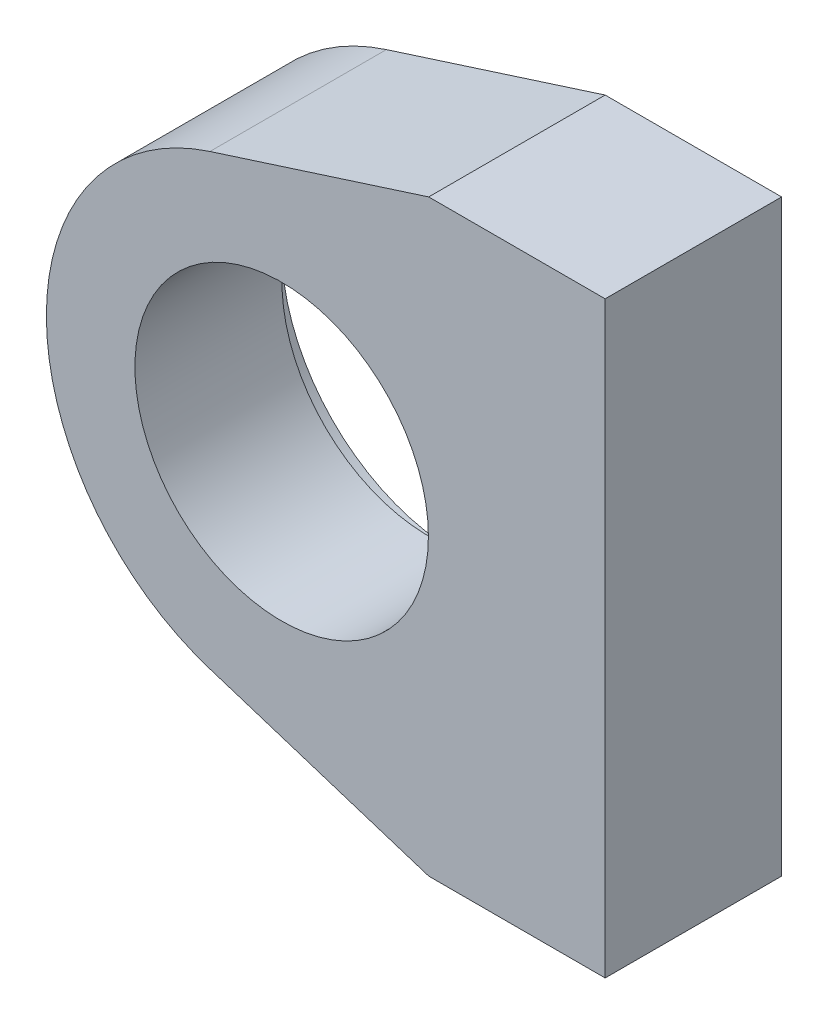
ISO-10303-21;
HEADER;
FILE_DESCRIPTION(('STEP AP214'),'2;1');
FILE_NAME('part.step','',(''),(''),'','','');
FILE_SCHEMA(('AUTOMOTIVE_DESIGN { 1 0 10303 214 1 1 1 1 }'));
ENDSEC;
DATA;
#1=APPLICATION_CONTEXT('core data for automotive mechanical design processes');
#2=APPLICATION_PROTOCOL_DEFINITION('international standard','automotive_design',2000,#1);
#3=PRODUCT_CONTEXT('',#1,'mechanical');
#4=PRODUCT('Part','Part','',(#3));
#5=PRODUCT_RELATED_PRODUCT_CATEGORY('part','',(#4));
#6=PRODUCT_DEFINITION_FORMATION('','',#4);
#7=PRODUCT_DEFINITION_CONTEXT('part definition',#1,'design');
#8=PRODUCT_DEFINITION('design','',#6,#7);
#9=PRODUCT_DEFINITION_SHAPE('','',#8);
#10=(LENGTH_UNIT() NAMED_UNIT(*) SI_UNIT(.MILLI.,.METRE.));
#11=(NAMED_UNIT(*) PLANE_ANGLE_UNIT() SI_UNIT($,.RADIAN.));
#12=(NAMED_UNIT(*) SI_UNIT($,.STERADIAN.) SOLID_ANGLE_UNIT());
#13=UNCERTAINTY_MEASURE_WITH_UNIT(LENGTH_MEASURE(1.E-05),#10,'distance_accuracy_value','');
#14=(GEOMETRIC_REPRESENTATION_CONTEXT(3) GLOBAL_UNCERTAINTY_ASSIGNED_CONTEXT((#13)) GLOBAL_UNIT_ASSIGNED_CONTEXT((#10,
#11,#12)) REPRESENTATION_CONTEXT('',''));
#15=CARTESIAN_POINT('',(0.,0.,0.));
#16=DIRECTION('',(0.,0.,1.));
#17=DIRECTION('',(1.,0.,0.));
#18=AXIS2_PLACEMENT_3D('',#15,#16,#17);
#19=CARTESIAN_POINT('',(0.,0.,-0.00100000000000013));
#20=DIRECTION('',(0.,0.,1.));
#21=DIRECTION('',(1.,0.,0.));
#22=AXIS2_PLACEMENT_3D('',#19,#20,#21);
#23=CYLINDRICAL_SURFACE('',#22,4.99);
#24=CARTESIAN_POINT('',(0.,0.,6.));
#25=DIRECTION('',(0.,0.,1.));
#26=DIRECTION('',(1.,0.,0.));
#27=AXIS2_PLACEMENT_3D('',#24,#25,#26);
#28=CIRCLE('',#27,4.99);
#29=CARTESIAN_POINT('',(4.99,0.,6.));
#30=VERTEX_POINT('',#29);
#31=EDGE_CURVE('E123',#30,#30,#28,.T.);
#32=CARTESIAN_POINT('',(0.,0.,1.));
#33=DIRECTION('',(0.,0.,-1.));
#34=DIRECTION('',(-1.,0.,0.));
#35=AXIS2_PLACEMENT_3D('',#32,#33,#34);
#36=CIRCLE('',#35,4.99);
#37=CARTESIAN_POINT('',(4.99,0.,1.));
#38=VERTEX_POINT('',#37);
#39=EDGE_CURVE('E37',#38,#38,#36,.F.);
#40=CARTESIAN_POINT('',(4.99,0.,6.));
#41=CARTESIAN_POINT('',(4.99,0.,5.94791666666667));
#42=CARTESIAN_POINT('',(4.99,0.,5.89583333333333));
#43=CARTESIAN_POINT('',(4.99,0.,5.79166666666667));
#44=CARTESIAN_POINT('',(4.99,0.,5.73958333333333));
#45=CARTESIAN_POINT('',(4.99,0.,5.63541666666667));
#46=CARTESIAN_POINT('',(4.99,0.,5.58333333333333));
#47=CARTESIAN_POINT('',(4.99,0.,5.47916666666667));
#48=CARTESIAN_POINT('',(4.99,0.,5.42708333333333));
#49=CARTESIAN_POINT('',(4.99,0.,5.32291666666667));
#50=CARTESIAN_POINT('',(4.99,0.,5.27083333333333));
#51=CARTESIAN_POINT('',(4.99,0.,5.16666666666667));
#52=CARTESIAN_POINT('',(4.99,0.,5.11458333333333));
#53=CARTESIAN_POINT('',(4.99,0.,5.01041666666667));
#54=CARTESIAN_POINT('',(4.99,0.,4.95833333333333));
#55=CARTESIAN_POINT('',(4.99,0.,4.85416666666667));
#56=CARTESIAN_POINT('',(4.99,0.,4.80208333333333));
#57=CARTESIAN_POINT('',(4.99,0.,4.69791666666667));
#58=CARTESIAN_POINT('',(4.99,0.,4.64583333333333));
#59=CARTESIAN_POINT('',(4.99,0.,4.54166666666667));
#60=CARTESIAN_POINT('',(4.99,0.,4.48958333333333));
#61=CARTESIAN_POINT('',(4.99,0.,4.38541666666667));
#62=CARTESIAN_POINT('',(4.99,0.,4.33333333333333));
#63=CARTESIAN_POINT('',(4.99,0.,4.22916666666667));
#64=CARTESIAN_POINT('',(4.99,0.,4.17708333333333));
#65=CARTESIAN_POINT('',(4.99,0.,4.07291666666667));
#66=CARTESIAN_POINT('',(4.99,0.,4.02083333333333));
#67=CARTESIAN_POINT('',(4.99,0.,3.91666666666667));
#68=CARTESIAN_POINT('',(4.99,0.,3.86458333333333));
#69=CARTESIAN_POINT('',(4.99,0.,3.76041666666667));
#70=CARTESIAN_POINT('',(4.99,0.,3.70833333333333));
#71=CARTESIAN_POINT('',(4.99,0.,3.60416666666667));
#72=CARTESIAN_POINT('',(4.99,0.,3.55208333333333));
#73=CARTESIAN_POINT('',(4.99,0.,3.44791666666667));
#74=CARTESIAN_POINT('',(4.99,0.,3.39583333333333));
#75=CARTESIAN_POINT('',(4.99,0.,3.29166666666667));
#76=CARTESIAN_POINT('',(4.99,0.,3.23958333333333));
#77=CARTESIAN_POINT('',(4.99,0.,3.13541666666667));
#78=CARTESIAN_POINT('',(4.99,0.,3.08333333333333));
#79=CARTESIAN_POINT('',(4.99,0.,2.97916666666667));
#80=CARTESIAN_POINT('',(4.99,0.,2.92708333333333));
#81=CARTESIAN_POINT('',(4.99,0.,2.82291666666667));
#82=CARTESIAN_POINT('',(4.99,0.,2.77083333333333));
#83=CARTESIAN_POINT('',(4.99,0.,2.66666666666667));
#84=CARTESIAN_POINT('',(4.99,0.,2.61458333333333));
#85=CARTESIAN_POINT('',(4.99,0.,2.51041666666667));
#86=CARTESIAN_POINT('',(4.99,0.,2.45833333333333));
#87=CARTESIAN_POINT('',(4.99,0.,2.35416666666667));
#88=CARTESIAN_POINT('',(4.99,0.,2.30208333333333));
#89=CARTESIAN_POINT('',(4.99,0.,2.19791666666667));
#90=CARTESIAN_POINT('',(4.99,0.,2.14583333333333));
#91=CARTESIAN_POINT('',(4.99,0.,2.04166666666667));
#92=CARTESIAN_POINT('',(4.99,0.,1.98958333333333));
#93=CARTESIAN_POINT('',(4.99,0.,1.88541666666667));
#94=CARTESIAN_POINT('',(4.99,0.,1.83333333333333));
#95=CARTESIAN_POINT('',(4.99,0.,1.72916666666667));
#96=CARTESIAN_POINT('',(4.99,0.,1.67708333333333));
#97=CARTESIAN_POINT('',(4.99,0.,1.57291666666667));
#98=CARTESIAN_POINT('',(4.99,0.,1.52083333333333));
#99=CARTESIAN_POINT('',(4.99,0.,1.41666666666667));
#100=CARTESIAN_POINT('',(4.99,0.,1.36458333333333));
#101=CARTESIAN_POINT('',(4.99,0.,1.26041666666667));
#102=CARTESIAN_POINT('',(4.99,0.,1.20833333333333));
#103=CARTESIAN_POINT('',(4.99,0.,1.10416666666667));
#104=CARTESIAN_POINT('',(4.99,0.,1.05208333333333));
#105=CARTESIAN_POINT('',(4.99,0.,1.));
#106=B_SPLINE_CURVE_WITH_KNOTS('',3,(#40,#41,#42,#43,#44,#45,#46,#47,#48,#49,#50,#51,#52,#53,
#54,#55,#56,#57,#58,#59,#60,#61,#62,#63,#64,#65,#66,#67,#68,#69,#70,#71,#72,#73,#74,#75,#76,#77,
#78,#79,#80,#81,#82,#83,#84,#85,#86,#87,#88,#89,#90,#91,#92,#93,#94,#95,#96,#97,#98,#99,#100,
#101,#102,#103,#104,#105),.UNSPECIFIED.,.F.,.F.,(4,2,2,2,2,2,2,2,2,2,2,2,2,2,2,2,2,2,2,2,2,2,2,
2,2,2,2,2,2,2,2,2,4),(0.,0.15625,0.3125,0.46875,0.625000000000001,0.78125,0.9375,1.09375,1.25,
1.40625,1.5625,1.71875,1.875,2.03125,2.1875,2.34375,2.5,2.65625,2.8125,2.96875,3.125,3.28125,
3.4375,3.59375,3.75,3.90625,4.0625,4.21875,4.375,4.53125,4.6875,4.84375,5.),.UNSPECIFIED.);
#107=EDGE_CURVE('BSEAM33',#30,#38,#106,.T.);
#108=ORIENTED_EDGE('',*,*,#31,.T.);
#109=ORIENTED_EDGE('',*,*,#39,.F.);
#110=ORIENTED_EDGE('',*,*,#107,.T.);
#111=ORIENTED_EDGE('',*,*,#107,.F.);
#112=EDGE_LOOP('',(#108,#110,#109,#111));
#113=FACE_BOUND('',#112,.T.);
#114=ADVANCED_FACE('F33',(#113),#23,.F.);
#115=CARTESIAN_POINT('',(0.,0.,6.));
#116=DIRECTION('',(0.,0.,1.));
#117=DIRECTION('',(1.,0.,0.));
#118=AXIS2_PLACEMENT_3D('',#115,#116,#117);
#119=PLANE('',#118);
#120=ORIENTED_EDGE('',*,*,#31,.F.);
#121=EDGE_LOOP('',(#120));
#122=FACE_BOUND('',#121,.T.);
#123=CARTESIAN_POINT('',(0.,0.,6.));
#124=DIRECTION('',(0.,0.,1.));
#125=DIRECTION('',(1.,0.,0.));
#126=AXIS2_PLACEMENT_3D('',#123,#124,#125);
#127=CIRCLE('',#126,8.);
#128=CARTESIAN_POINT('',(-2.43855979258026,7.61927989629013,6.));
#129=VERTEX_POINT('',#128);
#130=CARTESIAN_POINT('',(-2.43855979258026,-7.61927989629013,6.));
#131=VERTEX_POINT('',#130);
#132=EDGE_CURVE('E130',#129,#131,#127,.T.);
#133=ORIENTED_EDGE('',*,*,#132,.T.);
#134=DIRECTION('',(0.952409987036266,-0.304819974072533,0.));
#135=VECTOR('',#134,1.);
#136=CARTESIAN_POINT('',(-2.43855979258026,-7.61927989629013,6.));
#137=LINE('',#136,#135);
#138=CARTESIAN_POINT('',(5.,-10.,6.));
#139=VERTEX_POINT('',#138);
#140=EDGE_CURVE('E88',#131,#139,#137,.T.);
#141=ORIENTED_EDGE('',*,*,#140,.T.);
#142=DIRECTION('',(1.,0.,0.));
#143=VECTOR('',#142,1.);
#144=CARTESIAN_POINT('',(5.,-10.,6.));
#145=LINE('',#144,#143);
#146=CARTESIAN_POINT('',(11.,-10.,6.));
#147=VERTEX_POINT('',#146);
#148=EDGE_CURVE('E101',#139,#147,#145,.T.);
#149=ORIENTED_EDGE('',*,*,#148,.T.);
#150=DIRECTION('',(0.,1.,0.));
#151=VECTOR('',#150,1.);
#152=CARTESIAN_POINT('',(11.,-10.,6.));
#153=LINE('',#152,#151);
#154=CARTESIAN_POINT('',(11.,10.,6.));
#155=VERTEX_POINT('',#154);
#156=EDGE_CURVE('E95',#147,#155,#153,.T.);
#157=ORIENTED_EDGE('',*,*,#156,.T.);
#158=DIRECTION('',(-1.,0.,0.));
#159=VECTOR('',#158,1.);
#160=CARTESIAN_POINT('',(5.,10.,6.));
#161=LINE('',#160,#159);
#162=CARTESIAN_POINT('',(5.,10.,6.));
#163=VERTEX_POINT('',#162);
#164=EDGE_CURVE('E99',#155,#163,#161,.T.);
#165=ORIENTED_EDGE('',*,*,#164,.T.);
#166=DIRECTION('',(-0.952409987036266,-0.304819974072532,0.));
#167=VECTOR('',#166,1.);
#168=CARTESIAN_POINT('',(-2.43855979258026,7.61927989629013,6.));
#169=LINE('',#168,#167);
#170=EDGE_CURVE('E51',#163,#129,#169,.T.);
#171=ORIENTED_EDGE('',*,*,#170,.T.);
#172=EDGE_LOOP('',(#133,#141,#149,#157,#165,#171));
#173=FACE_BOUND('',#172,.T.);
#174=ADVANCED_FACE('F97',(#122,#173),#119,.T.);
#175=CARTESIAN_POINT('',(0.,0.,0.));
#176=DIRECTION('',(0.,0.,1.));
#177=DIRECTION('',(1.,0.,0.));
#178=AXIS2_PLACEMENT_3D('',#175,#176,#177);
#179=PLANE('',#178);
#180=CARTESIAN_POINT('',(0.,0.,0.));
#181=DIRECTION('',(0.,0.,-1.));
#182=DIRECTION('',(-1.,0.,0.));
#183=AXIS2_PLACEMENT_3D('',#180,#181,#182);
#184=CIRCLE('',#183,6.);
#185=CARTESIAN_POINT('',(-6.,0.,0.));
#186=VERTEX_POINT('',#185);
#187=EDGE_CURVE('E176',#186,#186,#184,.T.);
#188=ORIENTED_EDGE('',*,*,#187,.F.);
#189=EDGE_LOOP('',(#188));
#190=FACE_BOUND('',#189,.T.);
#191=CARTESIAN_POINT('',(0.,0.,0.));
#192=DIRECTION('',(0.,0.,1.));
#193=DIRECTION('',(1.,0.,0.));
#194=AXIS2_PLACEMENT_3D('',#191,#192,#193);
#195=CIRCLE('',#194,8.);
#196=CARTESIAN_POINT('',(-2.43855979258026,7.61927989629013,0.));
#197=VERTEX_POINT('',#196);
#198=CARTESIAN_POINT('',(-2.43855979258026,-7.61927989629013,0.));
#199=VERTEX_POINT('',#198);
#200=EDGE_CURVE('E119',#197,#199,#195,.T.);
#201=ORIENTED_EDGE('',*,*,#200,.F.);
#202=DIRECTION('',(-0.952409987036266,-0.304819974072532,0.));
#203=VECTOR('',#202,1.);
#204=CARTESIAN_POINT('',(-2.43855979258026,7.61927989629013,0.));
#205=LINE('',#204,#203);
#206=CARTESIAN_POINT('',(5.,10.,0.));
#207=VERTEX_POINT('',#206);
#208=EDGE_CURVE('E80',#207,#197,#205,.T.);
#209=ORIENTED_EDGE('',*,*,#208,.F.);
#210=DIRECTION('',(-1.,0.,0.));
#211=VECTOR('',#210,1.);
#212=CARTESIAN_POINT('',(5.,10.,0.));
#213=LINE('',#212,#211);
#214=CARTESIAN_POINT('',(11.,10.,0.));
#215=VERTEX_POINT('',#214);
#216=EDGE_CURVE('E74',#215,#207,#213,.T.);
#217=ORIENTED_EDGE('',*,*,#216,.F.);
#218=DIRECTION('',(0.,1.,0.));
#219=VECTOR('',#218,1.);
#220=CARTESIAN_POINT('',(11.,-10.,0.));
#221=LINE('',#220,#219);
#222=CARTESIAN_POINT('',(11.,-10.,0.));
#223=VERTEX_POINT('',#222);
#224=EDGE_CURVE('E109',#223,#215,#221,.T.);
#225=ORIENTED_EDGE('',*,*,#224,.F.);
#226=DIRECTION('',(1.,0.,0.));
#227=VECTOR('',#226,1.);
#228=CARTESIAN_POINT('',(5.,-10.,0.));
#229=LINE('',#228,#227);
#230=CARTESIAN_POINT('',(5.,-10.,0.));
#231=VERTEX_POINT('',#230);
#232=EDGE_CURVE('E125',#231,#223,#229,.T.);
#233=ORIENTED_EDGE('',*,*,#232,.F.);
#234=DIRECTION('',(0.952409987036266,-0.304819974072533,0.));
#235=VECTOR('',#234,1.);
#236=CARTESIAN_POINT('',(-2.43855979258026,-7.61927989629013,0.));
#237=LINE('',#236,#235);
#238=EDGE_CURVE('E122',#199,#231,#237,.T.);
#239=ORIENTED_EDGE('',*,*,#238,.F.);
#240=EDGE_LOOP('',(#201,#209,#217,#225,#233,#239));
#241=FACE_BOUND('',#240,.T.);
#242=ADVANCED_FACE('F140',(#190,#241),#179,.F.);
#243=CARTESIAN_POINT('',(0.,0.,6.));
#244=DIRECTION('',(0.,0.,-1.));
#245=DIRECTION('',(-1.,0.,0.));
#246=AXIS2_PLACEMENT_3D('',#243,#244,#245);
#247=CYLINDRICAL_SURFACE('',#246,8.);
#248=ORIENTED_EDGE('',*,*,#200,.T.);
#249=DIRECTION('',(0.,0.,-1.));
#250=VECTOR('',#249,1.);
#251=CARTESIAN_POINT('',(-2.43855979258026,-7.61927989629013,6.));
#252=LINE('',#251,#250);
#253=EDGE_CURVE('E11',#131,#199,#252,.T.);
#254=ORIENTED_EDGE('',*,*,#253,.F.);
#255=ORIENTED_EDGE('',*,*,#132,.F.);
#256=DIRECTION('',(0.,0.,-1.));
#257=VECTOR('',#256,1.);
#258=CARTESIAN_POINT('',(-2.43855979258026,7.61927989629013,6.));
#259=LINE('',#258,#257);
#260=EDGE_CURVE('E115',#129,#197,#259,.T.);
#261=ORIENTED_EDGE('',*,*,#260,.T.);
#262=EDGE_LOOP('',(#248,#254,#255,#261));
#263=FACE_BOUND('',#262,.T.);
#264=ADVANCED_FACE('F35',(#263),#247,.T.);
#265=CARTESIAN_POINT('',(-2.43855979258026,-7.61927989629013,6.));
#266=DIRECTION('',(0.304819974072533,0.952409987036266,0.));
#267=DIRECTION('',(-0.952409987036266,0.304819974072533,0.));
#268=AXIS2_PLACEMENT_3D('',#265,#266,#267);
#269=PLANE('',#268);
#270=ORIENTED_EDGE('',*,*,#238,.T.);
#271=DIRECTION('',(0.,0.,-1.));
#272=VECTOR('',#271,1.);
#273=CARTESIAN_POINT('',(5.,-10.,6.));
#274=LINE('',#273,#272);
#275=EDGE_CURVE('E43',#139,#231,#274,.T.);
#276=ORIENTED_EDGE('',*,*,#275,.F.);
#277=ORIENTED_EDGE('',*,*,#140,.F.);
#278=ORIENTED_EDGE('',*,*,#253,.T.);
#279=EDGE_LOOP('',(#270,#276,#277,#278));
#280=FACE_BOUND('',#279,.T.);
#281=ADVANCED_FACE('F173',(#280),#269,.F.);
#282=CARTESIAN_POINT('',(5.,-10.,6.));
#283=DIRECTION('',(0.,1.,0.));
#284=DIRECTION('',(0.,0.,1.));
#285=AXIS2_PLACEMENT_3D('',#282,#283,#284);
#286=PLANE('',#285);
#287=ORIENTED_EDGE('',*,*,#232,.T.);
#288=DIRECTION('',(0.,0.,-1.));
#289=VECTOR('',#288,1.);
#290=CARTESIAN_POINT('',(11.,-10.,6.));
#291=LINE('',#290,#289);
#292=EDGE_CURVE('E110',#147,#223,#291,.T.);
#293=ORIENTED_EDGE('',*,*,#292,.F.);
#294=ORIENTED_EDGE('',*,*,#148,.F.);
#295=ORIENTED_EDGE('',*,*,#275,.T.);
#296=EDGE_LOOP('',(#287,#293,#294,#295));
#297=FACE_BOUND('',#296,.T.);
#298=ADVANCED_FACE('F137',(#297),#286,.F.);
#299=CARTESIAN_POINT('',(11.,-10.,6.));
#300=DIRECTION('',(-1.,0.,0.));
#301=DIRECTION('',(0.,0.,1.));
#302=AXIS2_PLACEMENT_3D('',#299,#300,#301);
#303=PLANE('',#302);
#304=ORIENTED_EDGE('',*,*,#224,.T.);
#305=DIRECTION('',(0.,0.,-1.));
#306=VECTOR('',#305,1.);
#307=CARTESIAN_POINT('',(11.,10.,6.));
#308=LINE('',#307,#306);
#309=EDGE_CURVE('E106',#155,#215,#308,.T.);
#310=ORIENTED_EDGE('',*,*,#309,.F.);
#311=ORIENTED_EDGE('',*,*,#156,.F.);
#312=ORIENTED_EDGE('',*,*,#292,.T.);
#313=EDGE_LOOP('',(#304,#310,#311,#312));
#314=FACE_BOUND('',#313,.T.);
#315=ADVANCED_FACE('F107',(#314),#303,.F.);
#316=CARTESIAN_POINT('',(5.,10.,6.));
#317=DIRECTION('',(0.,-1.,0.));
#318=DIRECTION('',(0.,0.,-1.));
#319=AXIS2_PLACEMENT_3D('',#316,#317,#318);
#320=PLANE('',#319);
#321=ORIENTED_EDGE('',*,*,#216,.T.);
#322=DIRECTION('',(0.,0.,-1.));
#323=VECTOR('',#322,1.);
#324=CARTESIAN_POINT('',(5.,10.,6.));
#325=LINE('',#324,#323);
#326=EDGE_CURVE('E111',#163,#207,#325,.T.);
#327=ORIENTED_EDGE('',*,*,#326,.F.);
#328=ORIENTED_EDGE('',*,*,#164,.F.);
#329=ORIENTED_EDGE('',*,*,#309,.T.);
#330=EDGE_LOOP('',(#321,#327,#328,#329));
#331=FACE_BOUND('',#330,.T.);
#332=ADVANCED_FACE('F113',(#331),#320,.F.);
#333=CARTESIAN_POINT('',(-2.43855979258026,7.61927989629013,6.));
#334=DIRECTION('',(0.304819974072532,-0.952409987036266,0.));
#335=DIRECTION('',(0.952409987036266,0.304819974072532,0.));
#336=AXIS2_PLACEMENT_3D('',#333,#334,#335);
#337=PLANE('',#336);
#338=ORIENTED_EDGE('',*,*,#208,.T.);
#339=ORIENTED_EDGE('',*,*,#260,.F.);
#340=ORIENTED_EDGE('',*,*,#170,.F.);
#341=ORIENTED_EDGE('',*,*,#326,.T.);
#342=EDGE_LOOP('',(#338,#339,#340,#341));
#343=FACE_BOUND('',#342,.T.);
#344=ADVANCED_FACE('F144',(#343),#337,.F.);
#345=CARTESIAN_POINT('',(0.,0.,1.));
#346=DIRECTION('',(0.,0.,-1.));
#347=DIRECTION('',(-1.,0.,0.));
#348=AXIS2_PLACEMENT_3D('',#345,#346,#347);
#349=PLANE('',#348);
#350=CARTESIAN_POINT('',(0.,0.,1.));
#351=DIRECTION('',(0.,0.,-1.));
#352=DIRECTION('',(-1.,0.,0.));
#353=AXIS2_PLACEMENT_3D('',#350,#351,#352);
#354=CIRCLE('',#353,6.);
#355=CARTESIAN_POINT('',(-6.,0.,1.));
#356=VERTEX_POINT('',#355);
#357=EDGE_CURVE('E178',#356,#356,#354,.T.);
#358=ORIENTED_EDGE('',*,*,#357,.T.);
#359=EDGE_LOOP('',(#358));
#360=FACE_BOUND('',#359,.T.);
#361=ORIENTED_EDGE('',*,*,#39,.T.);
#362=EDGE_LOOP('',(#361));
#363=FACE_BOUND('',#362,.T.);
#364=ADVANCED_FACE('F146',(#360,#363),#349,.T.);
#365=CARTESIAN_POINT('',(0.,0.,1.));
#366=DIRECTION('',(0.,0.,-1.));
#367=DIRECTION('',(-1.,0.,0.));
#368=AXIS2_PLACEMENT_3D('',#365,#366,#367);
#369=CYLINDRICAL_SURFACE('',#368,6.);
#370=ORIENTED_EDGE('',*,*,#357,.F.);
#371=EDGE_LOOP('',(#370));
#372=FACE_BOUND('',#371,.T.);
#373=ORIENTED_EDGE('',*,*,#187,.T.);
#374=EDGE_LOOP('',(#373));
#375=FACE_BOUND('',#374,.T.);
#376=ADVANCED_FACE('F152',(#372,#375),#369,.F.);
#377=CLOSED_SHELL('',(#114,#174,#242,#264,#281,#298,#315,#332,#344,#364,#376));
#378=MANIFOLD_SOLID_BREP('B2',#377);
#379=ADVANCED_BREP_SHAPE_REPRESENTATION('',(#18,#378),#14);
#380=SHAPE_DEFINITION_REPRESENTATION(#9,#379);
ENDSEC;
END-ISO-10303-21;
